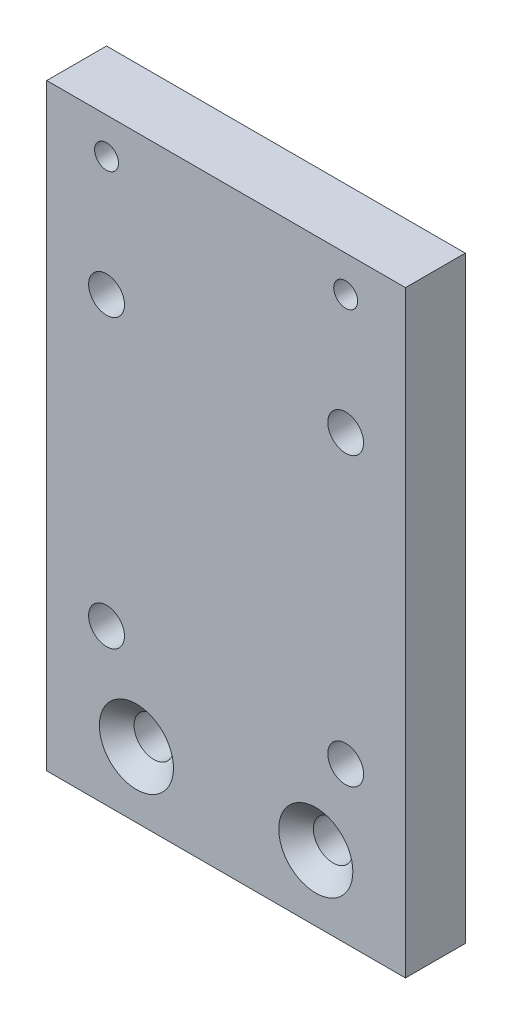
ISO-10303-21;
HEADER;
FILE_DESCRIPTION(('STEP AP214'),'2;1');
FILE_NAME('part.step','',(''),(''),'','','');
FILE_SCHEMA(('AUTOMOTIVE_DESIGN { 1 0 10303 214 1 1 1 1 }'));
ENDSEC;
DATA;
#1=APPLICATION_CONTEXT('core data for automotive mechanical design processes');
#2=APPLICATION_PROTOCOL_DEFINITION('international standard','automotive_design',2000,#1);
#3=PRODUCT_CONTEXT('',#1,'mechanical');
#4=PRODUCT('Part','Part','',(#3));
#5=PRODUCT_RELATED_PRODUCT_CATEGORY('part','',(#4));
#6=PRODUCT_DEFINITION_FORMATION('','',#4);
#7=PRODUCT_DEFINITION_CONTEXT('part definition',#1,'design');
#8=PRODUCT_DEFINITION('design','',#6,#7);
#9=PRODUCT_DEFINITION_SHAPE('','',#8);
#10=(LENGTH_UNIT() NAMED_UNIT(*) SI_UNIT(.MILLI.,.METRE.));
#11=(NAMED_UNIT(*) PLANE_ANGLE_UNIT() SI_UNIT($,.RADIAN.));
#12=(NAMED_UNIT(*) SI_UNIT($,.STERADIAN.) SOLID_ANGLE_UNIT());
#13=UNCERTAINTY_MEASURE_WITH_UNIT(LENGTH_MEASURE(1.E-05),#10,'distance_accuracy_value','');
#14=(GEOMETRIC_REPRESENTATION_CONTEXT(3) GLOBAL_UNCERTAINTY_ASSIGNED_CONTEXT((#13)) GLOBAL_UNIT_ASSIGNED_CONTEXT((#10,
#11,#12)) REPRESENTATION_CONTEXT('',''));
#15=CARTESIAN_POINT('',(0.,0.,0.));
#16=DIRECTION('',(0.,0.,1.));
#17=DIRECTION('',(1.,0.,0.));
#18=AXIS2_PLACEMENT_3D('',#15,#16,#17);
#19=CARTESIAN_POINT('',(15.,11.,10.0022999999965));
#20=DIRECTION('',(0.,0.,1.));
#21=DIRECTION('',(1.,0.,0.));
#22=AXIS2_PLACEMENT_3D('',#19,#20,#21);
#23=CONICAL_SURFACE('',#22,6.20000000001119,0.785398163397448);
#24=CARTESIAN_POINT('',(15.,11.,7.1023));
#25=DIRECTION('',(0.,0.,1.));
#26=DIRECTION('',(1.,0.,0.));
#27=AXIS2_PLACEMENT_3D('',#24,#25,#26);
#28=CIRCLE('',#27,3.3);
#29=CARTESIAN_POINT('',(18.3,11.,7.1023));
#30=VERTEX_POINT('',#29);
#31=EDGE_CURVE('E112',#30,#30,#28,.F.);
#32=ORIENTED_EDGE('',*,*,#31,.T.);
#33=EDGE_LOOP('',(#32));
#34=FACE_BOUND('',#33,.T.);
#35=CARTESIAN_POINT('',(15.,11.,10.0023000000206));
#36=DIRECTION('',(0.,0.,1.));
#37=DIRECTION('',(1.,0.,0.));
#38=AXIS2_PLACEMENT_3D('',#35,#36,#37);
#39=CIRCLE('',#38,6.20000000003529);
#40=CARTESIAN_POINT('',(21.2000000000353,11.,10.0023000000206));
#41=VERTEX_POINT('',#40);
#42=EDGE_CURVE('E19',#41,#41,#39,.F.);
#43=ORIENTED_EDGE('',*,*,#42,.F.);
#44=EDGE_LOOP('',(#43));
#45=FACE_BOUND('',#44,.T.);
#46=ADVANCED_FACE('F16',(#34,#45),#23,.F.);
#47=CARTESIAN_POINT('',(45.,11.,10.0022999999965));
#48=DIRECTION('',(0.,0.,1.));
#49=DIRECTION('',(1.,0.,0.));
#50=AXIS2_PLACEMENT_3D('',#47,#48,#49);
#51=CONICAL_SURFACE('',#50,6.20000000001119,0.785398163397448);
#52=CARTESIAN_POINT('',(45.,11.,7.1023));
#53=DIRECTION('',(0.,0.,1.));
#54=DIRECTION('',(1.,0.,0.));
#55=AXIS2_PLACEMENT_3D('',#52,#53,#54);
#56=CIRCLE('',#55,3.3);
#57=CARTESIAN_POINT('',(48.3,11.,7.1023));
#58=VERTEX_POINT('',#57);
#59=EDGE_CURVE('E105',#58,#58,#56,.F.);
#60=ORIENTED_EDGE('',*,*,#59,.T.);
#61=EDGE_LOOP('',(#60));
#62=FACE_BOUND('',#61,.T.);
#63=CARTESIAN_POINT('',(45.,11.,10.0023000000206));
#64=DIRECTION('',(0.,0.,1.));
#65=DIRECTION('',(1.,0.,0.));
#66=AXIS2_PLACEMENT_3D('',#63,#64,#65);
#67=CIRCLE('',#66,6.20000000003529);
#68=CARTESIAN_POINT('',(51.2000000000353,11.,10.0023000000206));
#69=VERTEX_POINT('',#68);
#70=EDGE_CURVE('E66',#69,#69,#67,.F.);
#71=ORIENTED_EDGE('',*,*,#70,.F.);
#72=EDGE_LOOP('',(#71));
#73=FACE_BOUND('',#72,.T.);
#74=ADVANCED_FACE('F130',(#62,#73),#51,.F.);
#75=CARTESIAN_POINT('',(0.,100.,10.0023));
#76=DIRECTION('',(0.,0.,1.));
#77=DIRECTION('',(1.,0.,0.));
#78=AXIS2_PLACEMENT_3D('',#75,#76,#77);
#79=PLANE('',#78);
#80=CARTESIAN_POINT('',(50.,26.,10.0023));
#81=DIRECTION('',(0.,0.,1.));
#82=DIRECTION('',(1.,0.,0.));
#83=AXIS2_PLACEMENT_3D('',#80,#81,#82);
#84=CIRCLE('',#83,3.);
#85=CARTESIAN_POINT('',(53.,26.,10.0023));
#86=VERTEX_POINT('',#85);
#87=EDGE_CURVE('E102',#86,#86,#84,.F.);
#88=ORIENTED_EDGE('',*,*,#87,.T.);
#89=EDGE_LOOP('',(#88));
#90=FACE_BOUND('',#89,.T.);
#91=ORIENTED_EDGE('',*,*,#70,.T.);
#92=EDGE_LOOP('',(#91));
#93=FACE_BOUND('',#92,.T.);
#94=CARTESIAN_POINT('',(50.,74.,10.0023));
#95=DIRECTION('',(0.,0.,1.));
#96=DIRECTION('',(1.,0.,0.));
#97=AXIS2_PLACEMENT_3D('',#94,#95,#96);
#98=CIRCLE('',#97,3.);
#99=CARTESIAN_POINT('',(53.,74.,10.0023));
#100=VERTEX_POINT('',#99);
#101=EDGE_CURVE('E106',#100,#100,#98,.F.);
#102=ORIENTED_EDGE('',*,*,#101,.T.);
#103=EDGE_LOOP('',(#102));
#104=FACE_BOUND('',#103,.T.);
#105=CARTESIAN_POINT('',(50.,94.,10.0023));
#106=DIRECTION('',(0.,0.,1.));
#107=DIRECTION('',(1.,0.,0.));
#108=AXIS2_PLACEMENT_3D('',#105,#106,#107);
#109=CIRCLE('',#108,2.);
#110=CARTESIAN_POINT('',(52.,94.,10.0023));
#111=VERTEX_POINT('',#110);
#112=EDGE_CURVE('E109',#111,#111,#109,.F.);
#113=ORIENTED_EDGE('',*,*,#112,.T.);
#114=EDGE_LOOP('',(#113));
#115=FACE_BOUND('',#114,.T.);
#116=ORIENTED_EDGE('',*,*,#42,.T.);
#117=EDGE_LOOP('',(#116));
#118=FACE_BOUND('',#117,.T.);
#119=CARTESIAN_POINT('',(10.,26.,10.0023));
#120=DIRECTION('',(0.,0.,1.));
#121=DIRECTION('',(1.,0.,0.));
#122=AXIS2_PLACEMENT_3D('',#119,#120,#121);
#123=CIRCLE('',#122,3.);
#124=CARTESIAN_POINT('',(13.,26.,10.0023));
#125=VERTEX_POINT('',#124);
#126=EDGE_CURVE('E113',#125,#125,#123,.F.);
#127=ORIENTED_EDGE('',*,*,#126,.T.);
#128=EDGE_LOOP('',(#127));
#129=FACE_BOUND('',#128,.T.);
#130=CARTESIAN_POINT('',(10.,74.,10.0023));
#131=DIRECTION('',(0.,0.,1.));
#132=DIRECTION('',(1.,0.,0.));
#133=AXIS2_PLACEMENT_3D('',#130,#131,#132);
#134=CIRCLE('',#133,3.);
#135=CARTESIAN_POINT('',(13.,74.,10.0023));
#136=VERTEX_POINT('',#135);
#137=EDGE_CURVE('E116',#136,#136,#134,.F.);
#138=ORIENTED_EDGE('',*,*,#137,.T.);
#139=EDGE_LOOP('',(#138));
#140=FACE_BOUND('',#139,.T.);
#141=CARTESIAN_POINT('',(10.,94.,10.0023));
#142=DIRECTION('',(0.,0.,1.));
#143=DIRECTION('',(1.,0.,0.));
#144=AXIS2_PLACEMENT_3D('',#141,#142,#143);
#145=CIRCLE('',#144,2.);
#146=CARTESIAN_POINT('',(12.,94.,10.0023));
#147=VERTEX_POINT('',#146);
#148=EDGE_CURVE('E119',#147,#147,#145,.F.);
#149=ORIENTED_EDGE('',*,*,#148,.T.);
#150=EDGE_LOOP('',(#149));
#151=FACE_BOUND('',#150,.T.);
#152=DIRECTION('',(1.,0.,0.));
#153=VECTOR('',#152,1.);
#154=CARTESIAN_POINT('',(0.,0.,10.0023));
#155=LINE('',#154,#153);
#156=CARTESIAN_POINT('',(60.,0.,10.0023));
#157=VERTEX_POINT('',#156);
#158=CARTESIAN_POINT('',(0.,0.,10.0023));
#159=VERTEX_POINT('',#158);
#160=EDGE_CURVE('E300',#157,#159,#155,.F.);
#161=ORIENTED_EDGE('',*,*,#160,.F.);
#162=DIRECTION('',(0.,1.,0.));
#163=VECTOR('',#162,1.);
#164=CARTESIAN_POINT('',(60.,100.,10.0023));
#165=LINE('',#164,#163);
#166=CARTESIAN_POINT('',(60.,100.,10.0023));
#167=VERTEX_POINT('',#166);
#168=EDGE_CURVE('E60',#167,#157,#165,.F.);
#169=ORIENTED_EDGE('',*,*,#168,.F.);
#170=DIRECTION('',(1.,0.,0.));
#171=VECTOR('',#170,1.);
#172=CARTESIAN_POINT('',(0.,100.,10.0023));
#173=LINE('',#172,#171);
#174=CARTESIAN_POINT('',(0.,100.,10.0023));
#175=VERTEX_POINT('',#174);
#176=EDGE_CURVE('E58',#167,#175,#173,.F.);
#177=ORIENTED_EDGE('',*,*,#176,.T.);
#178=DIRECTION('',(0.,1.,0.));
#179=VECTOR('',#178,1.);
#180=CARTESIAN_POINT('',(0.,100.,10.0023));
#181=LINE('',#180,#179);
#182=EDGE_CURVE('E55',#175,#159,#181,.F.);
#183=ORIENTED_EDGE('',*,*,#182,.T.);
#184=EDGE_LOOP('',(#161,#169,#177,#183));
#185=FACE_BOUND('',#184,.T.);
#186=ADVANCED_FACE('F59',(#90,#93,#104,#115,#118,#129,#140,#151,#185),#79,.T.);
#187=CARTESIAN_POINT('',(0.,100.,0.002300000000105));
#188=DIRECTION('',(0.,-1.,0.));
#189=DIRECTION('',(0.,0.,-1.));
#190=AXIS2_PLACEMENT_3D('',#187,#188,#189);
#191=PLANE('',#190);
#192=DIRECTION('',(0.,0.,-1.));
#193=VECTOR('',#192,1.);
#194=CARTESIAN_POINT('',(60.,100.,0.002300000000105));
#195=LINE('',#194,#193);
#196=CARTESIAN_POINT('',(60.,100.,0.0023000000000195));
#197=VERTEX_POINT('',#196);
#198=EDGE_CURVE('E304',#197,#167,#195,.F.);
#199=ORIENTED_EDGE('',*,*,#198,.F.);
#200=DIRECTION('',(1.,0.,0.));
#201=VECTOR('',#200,1.);
#202=CARTESIAN_POINT('',(0.,100.,0.002300000000105));
#203=LINE('',#202,#201);
#204=CARTESIAN_POINT('',(0.,100.,0.0023000000000195));
#205=VERTEX_POINT('',#204);
#206=EDGE_CURVE('E77',#197,#205,#203,.F.);
#207=ORIENTED_EDGE('',*,*,#206,.T.);
#208=DIRECTION('',(0.,0.,-1.));
#209=VECTOR('',#208,1.);
#210=CARTESIAN_POINT('',(0.,100.,0.002300000000105));
#211=LINE('',#210,#209);
#212=EDGE_CURVE('E65',#205,#175,#211,.F.);
#213=ORIENTED_EDGE('',*,*,#212,.T.);
#214=ORIENTED_EDGE('',*,*,#176,.F.);
#215=EDGE_LOOP('',(#199,#207,#213,#214));
#216=FACE_BOUND('',#215,.T.);
#217=ADVANCED_FACE('F76',(#216),#191,.F.);
#218=CARTESIAN_POINT('',(0.,100.,0.002300000000105));
#219=DIRECTION('',(1.,0.,0.));
#220=DIRECTION('',(0.,0.,-1.));
#221=AXIS2_PLACEMENT_3D('',#218,#219,#220);
#222=PLANE('',#221);
#223=ORIENTED_EDGE('',*,*,#182,.F.);
#224=ORIENTED_EDGE('',*,*,#212,.F.);
#225=DIRECTION('',(0.,1.,0.));
#226=VECTOR('',#225,1.);
#227=CARTESIAN_POINT('',(0.,100.,0.002300000000105));
#228=LINE('',#227,#226);
#229=CARTESIAN_POINT('',(0.,0.,0.0023000000000195));
#230=VERTEX_POINT('',#229);
#231=EDGE_CURVE('E311',#205,#230,#228,.F.);
#232=ORIENTED_EDGE('',*,*,#231,.T.);
#233=DIRECTION('',(0.,0.,-1.));
#234=VECTOR('',#233,1.);
#235=CARTESIAN_POINT('',(0.,0.,0.002300000000105));
#236=LINE('',#235,#234);
#237=EDGE_CURVE('E73',#159,#230,#236,.T.);
#238=ORIENTED_EDGE('',*,*,#237,.F.);
#239=EDGE_LOOP('',(#223,#224,#232,#238));
#240=FACE_BOUND('',#239,.T.);
#241=ADVANCED_FACE('F70',(#240),#222,.F.);
#242=CARTESIAN_POINT('',(0.,0.,0.002300000000105));
#243=DIRECTION('',(0.,-1.,0.));
#244=DIRECTION('',(0.,0.,-1.));
#245=AXIS2_PLACEMENT_3D('',#242,#243,#244);
#246=PLANE('',#245);
#247=DIRECTION('',(0.,0.,-1.));
#248=VECTOR('',#247,1.);
#249=CARTESIAN_POINT('',(60.,0.,0.002300000000105));
#250=LINE('',#249,#248);
#251=CARTESIAN_POINT('',(60.,0.,0.0023000000000195));
#252=VERTEX_POINT('',#251);
#253=EDGE_CURVE('E34',#157,#252,#250,.T.);
#254=ORIENTED_EDGE('',*,*,#253,.F.);
#255=ORIENTED_EDGE('',*,*,#160,.T.);
#256=ORIENTED_EDGE('',*,*,#237,.T.);
#257=DIRECTION('',(1.,0.,0.));
#258=VECTOR('',#257,1.);
#259=CARTESIAN_POINT('',(0.,0.,0.002300000000105));
#260=LINE('',#259,#258);
#261=EDGE_CURVE('E302',#230,#252,#260,.T.);
#262=ORIENTED_EDGE('',*,*,#261,.T.);
#263=EDGE_LOOP('',(#254,#255,#256,#262));
#264=FACE_BOUND('',#263,.T.);
#265=ADVANCED_FACE('F182',(#264),#246,.T.);
#266=CARTESIAN_POINT('',(60.,100.,0.002300000000105));
#267=DIRECTION('',(1.,0.,0.));
#268=DIRECTION('',(0.,0.,-1.));
#269=AXIS2_PLACEMENT_3D('',#266,#267,#268);
#270=PLANE('',#269);
#271=ORIENTED_EDGE('',*,*,#168,.T.);
#272=ORIENTED_EDGE('',*,*,#253,.T.);
#273=DIRECTION('',(0.,1.,0.));
#274=VECTOR('',#273,1.);
#275=CARTESIAN_POINT('',(60.,100.,0.002300000000105));
#276=LINE('',#275,#274);
#277=EDGE_CURVE('E101',#252,#197,#276,.T.);
#278=ORIENTED_EDGE('',*,*,#277,.T.);
#279=ORIENTED_EDGE('',*,*,#198,.T.);
#280=EDGE_LOOP('',(#271,#272,#278,#279));
#281=FACE_BOUND('',#280,.T.);
#282=ADVANCED_FACE('F178',(#281),#270,.T.);
#283=CARTESIAN_POINT('',(10.,94.,0.002300000000105));
#284=DIRECTION('',(0.,0.,1.));
#285=DIRECTION('',(1.,0.,0.));
#286=AXIS2_PLACEMENT_3D('',#283,#284,#285);
#287=CYLINDRICAL_SURFACE('',#286,2.);
#288=CARTESIAN_POINT('',(10.,94.,0.002299999999991));
#289=DIRECTION('',(0.,0.,1.));
#290=DIRECTION('',(1.,0.,0.));
#291=AXIS2_PLACEMENT_3D('',#288,#289,#290);
#292=CIRCLE('',#291,2.);
#293=CARTESIAN_POINT('',(12.,94.,0.002299999999991));
#294=VERTEX_POINT('',#293);
#295=EDGE_CURVE('E98',#294,#294,#292,.F.);
#296=ORIENTED_EDGE('',*,*,#295,.T.);
#297=EDGE_LOOP('',(#296));
#298=FACE_BOUND('',#297,.T.);
#299=ORIENTED_EDGE('',*,*,#148,.F.);
#300=EDGE_LOOP('',(#299));
#301=FACE_BOUND('',#300,.T.);
#302=ADVANCED_FACE('F174',(#298,#301),#287,.F.);
#303=CARTESIAN_POINT('',(10.,74.,0.002300000000105));
#304=DIRECTION('',(0.,0.,1.));
#305=DIRECTION('',(1.,0.,0.));
#306=AXIS2_PLACEMENT_3D('',#303,#304,#305);
#307=CYLINDRICAL_SURFACE('',#306,3.);
#308=CARTESIAN_POINT('',(10.,74.,0.002299999999991));
#309=DIRECTION('',(0.,0.,1.));
#310=DIRECTION('',(1.,0.,0.));
#311=AXIS2_PLACEMENT_3D('',#308,#309,#310);
#312=CIRCLE('',#311,3.);
#313=CARTESIAN_POINT('',(13.,74.,0.002299999999991));
#314=VERTEX_POINT('',#313);
#315=EDGE_CURVE('E95',#314,#314,#312,.F.);
#316=ORIENTED_EDGE('',*,*,#315,.T.);
#317=EDGE_LOOP('',(#316));
#318=FACE_BOUND('',#317,.T.);
#319=ORIENTED_EDGE('',*,*,#137,.F.);
#320=EDGE_LOOP('',(#319));
#321=FACE_BOUND('',#320,.T.);
#322=ADVANCED_FACE('F170',(#318,#321),#307,.F.);
#323=CARTESIAN_POINT('',(10.,26.,0.002300000000105));
#324=DIRECTION('',(0.,0.,1.));
#325=DIRECTION('',(1.,0.,0.));
#326=AXIS2_PLACEMENT_3D('',#323,#324,#325);
#327=CYLINDRICAL_SURFACE('',#326,3.);
#328=CARTESIAN_POINT('',(10.,26.,0.002299999999991));
#329=DIRECTION('',(0.,0.,1.));
#330=DIRECTION('',(1.,0.,0.));
#331=AXIS2_PLACEMENT_3D('',#328,#329,#330);
#332=CIRCLE('',#331,3.);
#333=CARTESIAN_POINT('',(13.,26.,0.002299999999991));
#334=VERTEX_POINT('',#333);
#335=EDGE_CURVE('E92',#334,#334,#332,.F.);
#336=ORIENTED_EDGE('',*,*,#335,.T.);
#337=EDGE_LOOP('',(#336));
#338=FACE_BOUND('',#337,.T.);
#339=ORIENTED_EDGE('',*,*,#126,.F.);
#340=EDGE_LOOP('',(#339));
#341=FACE_BOUND('',#340,.T.);
#342=ADVANCED_FACE('F166',(#338,#341),#327,.F.);
#343=CARTESIAN_POINT('',(15.,11.,0.002300000000105));
#344=DIRECTION('',(0.,0.,1.));
#345=DIRECTION('',(1.,0.,0.));
#346=AXIS2_PLACEMENT_3D('',#343,#344,#345);
#347=CYLINDRICAL_SURFACE('',#346,3.3);
#348=CARTESIAN_POINT('',(15.,11.,0.002299999999991));
#349=DIRECTION('',(0.,0.,1.));
#350=DIRECTION('',(1.,0.,0.));
#351=AXIS2_PLACEMENT_3D('',#348,#349,#350);
#352=CIRCLE('',#351,3.3);
#353=CARTESIAN_POINT('',(18.3,11.,0.002299999999991));
#354=VERTEX_POINT('',#353);
#355=EDGE_CURVE('E89',#354,#354,#352,.F.);
#356=ORIENTED_EDGE('',*,*,#355,.T.);
#357=EDGE_LOOP('',(#356));
#358=FACE_BOUND('',#357,.T.);
#359=ORIENTED_EDGE('',*,*,#31,.F.);
#360=EDGE_LOOP('',(#359));
#361=FACE_BOUND('',#360,.T.);
#362=ADVANCED_FACE('F162',(#358,#361),#347,.F.);
#363=CARTESIAN_POINT('',(50.,94.,0.002300000000105));
#364=DIRECTION('',(0.,0.,1.));
#365=DIRECTION('',(1.,0.,0.));
#366=AXIS2_PLACEMENT_3D('',#363,#364,#365);
#367=CYLINDRICAL_SURFACE('',#366,2.);
#368=CARTESIAN_POINT('',(50.,94.,0.002299999999991));
#369=DIRECTION('',(0.,0.,1.));
#370=DIRECTION('',(1.,0.,0.));
#371=AXIS2_PLACEMENT_3D('',#368,#369,#370);
#372=CIRCLE('',#371,2.);
#373=CARTESIAN_POINT('',(52.,94.,0.002299999999991));
#374=VERTEX_POINT('',#373);
#375=EDGE_CURVE('E86',#374,#374,#372,.F.);
#376=ORIENTED_EDGE('',*,*,#375,.T.);
#377=EDGE_LOOP('',(#376));
#378=FACE_BOUND('',#377,.T.);
#379=ORIENTED_EDGE('',*,*,#112,.F.);
#380=EDGE_LOOP('',(#379));
#381=FACE_BOUND('',#380,.T.);
#382=ADVANCED_FACE('F158',(#378,#381),#367,.F.);
#383=CARTESIAN_POINT('',(50.,74.,0.002300000000105));
#384=DIRECTION('',(0.,0.,1.));
#385=DIRECTION('',(1.,0.,0.));
#386=AXIS2_PLACEMENT_3D('',#383,#384,#385);
#387=CYLINDRICAL_SURFACE('',#386,3.);
#388=CARTESIAN_POINT('',(50.,74.,0.002299999999991));
#389=DIRECTION('',(0.,0.,1.));
#390=DIRECTION('',(1.,0.,0.));
#391=AXIS2_PLACEMENT_3D('',#388,#389,#390);
#392=CIRCLE('',#391,3.);
#393=CARTESIAN_POINT('',(53.,74.,0.002299999999991));
#394=VERTEX_POINT('',#393);
#395=EDGE_CURVE('E83',#394,#394,#392,.F.);
#396=ORIENTED_EDGE('',*,*,#395,.T.);
#397=EDGE_LOOP('',(#396));
#398=FACE_BOUND('',#397,.T.);
#399=ORIENTED_EDGE('',*,*,#101,.F.);
#400=EDGE_LOOP('',(#399));
#401=FACE_BOUND('',#400,.T.);
#402=ADVANCED_FACE('F154',(#398,#401),#387,.F.);
#403=CARTESIAN_POINT('',(45.,11.,0.002300000000105));
#404=DIRECTION('',(0.,0.,1.));
#405=DIRECTION('',(1.,0.,0.));
#406=AXIS2_PLACEMENT_3D('',#403,#404,#405);
#407=CYLINDRICAL_SURFACE('',#406,3.3);
#408=CARTESIAN_POINT('',(45.,11.,0.002299999999991));
#409=DIRECTION('',(0.,0.,1.));
#410=DIRECTION('',(1.,0.,0.));
#411=AXIS2_PLACEMENT_3D('',#408,#409,#410);
#412=CIRCLE('',#411,3.3);
#413=CARTESIAN_POINT('',(48.3,11.,0.002299999999991));
#414=VERTEX_POINT('',#413);
#415=EDGE_CURVE('E25',#414,#414,#412,.F.);
#416=ORIENTED_EDGE('',*,*,#415,.T.);
#417=EDGE_LOOP('',(#416));
#418=FACE_BOUND('',#417,.T.);
#419=ORIENTED_EDGE('',*,*,#59,.F.);
#420=EDGE_LOOP('',(#419));
#421=FACE_BOUND('',#420,.T.);
#422=ADVANCED_FACE('F146',(#418,#421),#407,.F.);
#423=CARTESIAN_POINT('',(50.,26.,0.002300000000105));
#424=DIRECTION('',(0.,0.,1.));
#425=DIRECTION('',(1.,0.,0.));
#426=AXIS2_PLACEMENT_3D('',#423,#424,#425);
#427=CYLINDRICAL_SURFACE('',#426,3.);
#428=CARTESIAN_POINT('',(50.,26.,0.002299999999991));
#429=DIRECTION('',(0.,0.,1.));
#430=DIRECTION('',(1.,0.,0.));
#431=AXIS2_PLACEMENT_3D('',#428,#429,#430);
#432=CIRCLE('',#431,3.);
#433=CARTESIAN_POINT('',(53.,26.,0.002299999999991));
#434=VERTEX_POINT('',#433);
#435=EDGE_CURVE('E11',#434,#434,#432,.F.);
#436=ORIENTED_EDGE('',*,*,#435,.T.);
#437=EDGE_LOOP('',(#436));
#438=FACE_BOUND('',#437,.T.);
#439=ORIENTED_EDGE('',*,*,#87,.F.);
#440=EDGE_LOOP('',(#439));
#441=FACE_BOUND('',#440,.T.);
#442=ADVANCED_FACE('F140',(#438,#441),#427,.F.);
#443=CARTESIAN_POINT('',(0.,100.,0.002300000000105));
#444=DIRECTION('',(0.,0.,1.));
#445=DIRECTION('',(1.,0.,0.));
#446=AXIS2_PLACEMENT_3D('',#443,#444,#445);
#447=PLANE('',#446);
#448=ORIENTED_EDGE('',*,*,#435,.F.);
#449=EDGE_LOOP('',(#448));
#450=FACE_BOUND('',#449,.T.);
#451=ORIENTED_EDGE('',*,*,#415,.F.);
#452=EDGE_LOOP('',(#451));
#453=FACE_BOUND('',#452,.T.);
#454=ORIENTED_EDGE('',*,*,#395,.F.);
#455=EDGE_LOOP('',(#454));
#456=FACE_BOUND('',#455,.T.);
#457=ORIENTED_EDGE('',*,*,#375,.F.);
#458=EDGE_LOOP('',(#457));
#459=FACE_BOUND('',#458,.T.);
#460=ORIENTED_EDGE('',*,*,#355,.F.);
#461=EDGE_LOOP('',(#460));
#462=FACE_BOUND('',#461,.T.);
#463=ORIENTED_EDGE('',*,*,#335,.F.);
#464=EDGE_LOOP('',(#463));
#465=FACE_BOUND('',#464,.T.);
#466=ORIENTED_EDGE('',*,*,#315,.F.);
#467=EDGE_LOOP('',(#466));
#468=FACE_BOUND('',#467,.T.);
#469=ORIENTED_EDGE('',*,*,#295,.F.);
#470=EDGE_LOOP('',(#469));
#471=FACE_BOUND('',#470,.T.);
#472=ORIENTED_EDGE('',*,*,#261,.F.);
#473=ORIENTED_EDGE('',*,*,#231,.F.);
#474=ORIENTED_EDGE('',*,*,#206,.F.);
#475=ORIENTED_EDGE('',*,*,#277,.F.);
#476=EDGE_LOOP('',(#472,#473,#474,#475));
#477=FACE_BOUND('',#476,.T.);
#478=ADVANCED_FACE('F138',(#450,#453,#456,#459,#462,#465,#468,#471,#477),#447,.F.);
#479=CLOSED_SHELL('',(#46,#74,#186,#217,#241,#265,#282,#302,#322,#342,#362,#382,#402,#422,#442,#478));
#480=MANIFOLD_SOLID_BREP('B1',#479);
#481=ADVANCED_BREP_SHAPE_REPRESENTATION('',(#18,#480),#14);
#482=SHAPE_DEFINITION_REPRESENTATION(#9,#481);
ENDSEC;
END-ISO-10303-21;
